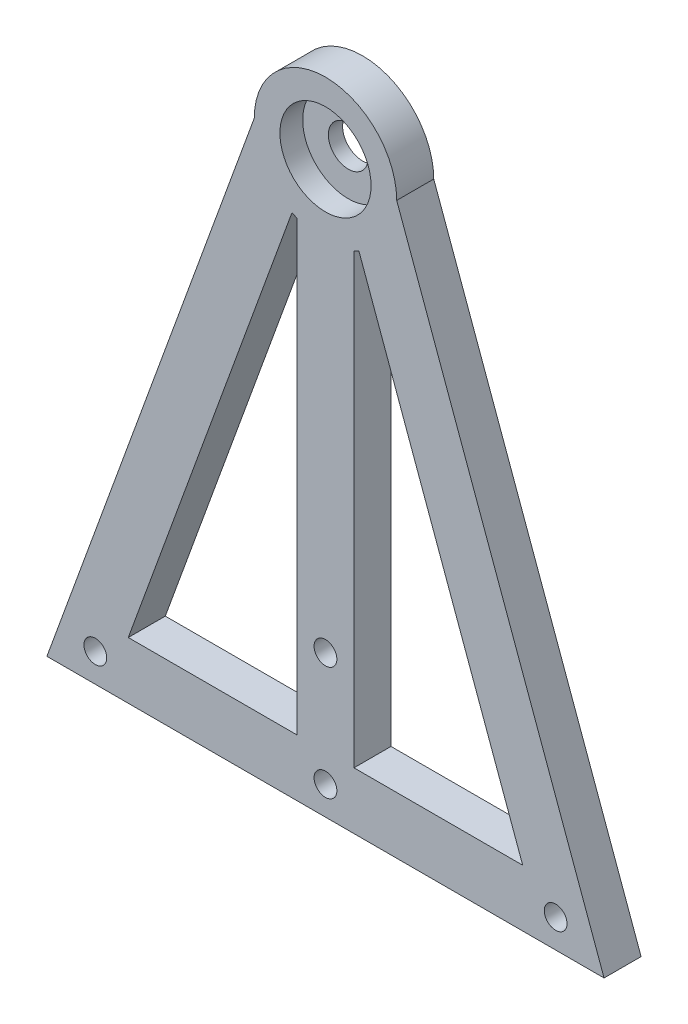
ISO-10303-21;
HEADER;
FILE_DESCRIPTION(('STEP AP214'),'2;1');
FILE_NAME('part.step','',(''),(''),'','','');
FILE_SCHEMA(('AUTOMOTIVE_DESIGN { 1 0 10303 214 1 1 1 1 }'));
ENDSEC;
DATA;
#1=APPLICATION_CONTEXT('core data for automotive mechanical design processes');
#2=APPLICATION_PROTOCOL_DEFINITION('international standard','automotive_design',2000,#1);
#3=PRODUCT_CONTEXT('',#1,'mechanical');
#4=PRODUCT('Part','Part','',(#3));
#5=PRODUCT_RELATED_PRODUCT_CATEGORY('part','',(#4));
#6=PRODUCT_DEFINITION_FORMATION('','',#4);
#7=PRODUCT_DEFINITION_CONTEXT('part definition',#1,'design');
#8=PRODUCT_DEFINITION('design','',#6,#7);
#9=PRODUCT_DEFINITION_SHAPE('','',#8);
#10=(LENGTH_UNIT() NAMED_UNIT(*) SI_UNIT(.MILLI.,.METRE.));
#11=(NAMED_UNIT(*) PLANE_ANGLE_UNIT() SI_UNIT($,.RADIAN.));
#12=(NAMED_UNIT(*) SI_UNIT($,.STERADIAN.) SOLID_ANGLE_UNIT());
#13=UNCERTAINTY_MEASURE_WITH_UNIT(LENGTH_MEASURE(1.E-05),#10,'distance_accuracy_value','');
#14=(GEOMETRIC_REPRESENTATION_CONTEXT(3) GLOBAL_UNCERTAINTY_ASSIGNED_CONTEXT((#13)) GLOBAL_UNIT_ASSIGNED_CONTEXT((#10,
#11,#12)) REPRESENTATION_CONTEXT('',''));
#15=CARTESIAN_POINT('',(0.,0.,0.));
#16=DIRECTION('',(0.,0.,1.));
#17=DIRECTION('',(1.,0.,0.));
#18=AXIS2_PLACEMENT_3D('',#15,#16,#17);
#19=CARTESIAN_POINT('',(0.,100.,-0.00100000000000013));
#20=DIRECTION('',(0.,0.,1.));
#21=DIRECTION('',(1.,0.,0.));
#22=AXIS2_PLACEMENT_3D('',#19,#20,#21);
#23=CYLINDRICAL_SURFACE('',#22,3.5);
#24=CARTESIAN_POINT('',(0.,100.,0.));
#25=DIRECTION('',(0.,0.,1.));
#26=DIRECTION('',(1.,0.,0.));
#27=AXIS2_PLACEMENT_3D('',#24,#25,#26);
#28=CIRCLE('',#27,3.5);
#29=CARTESIAN_POINT('',(3.5,100.,0.));
#30=VERTEX_POINT('',#29);
#31=EDGE_CURVE('E257',#30,#30,#28,.F.);
#32=CARTESIAN_POINT('',(0.,100.,2.5));
#33=DIRECTION('',(0.,0.,1.));
#34=DIRECTION('',(1.,0.,0.));
#35=AXIS2_PLACEMENT_3D('',#32,#33,#34);
#36=CIRCLE('',#35,3.5);
#37=CARTESIAN_POINT('',(3.5,100.,2.5));
#38=VERTEX_POINT('',#37);
#39=EDGE_CURVE('E444',#38,#38,#36,.T.);
#40=CARTESIAN_POINT('',(3.5,100.,0.));
#41=CARTESIAN_POINT('',(3.5,100.,0.0260416666666666));
#42=CARTESIAN_POINT('',(3.5,100.,0.0520833333333333));
#43=CARTESIAN_POINT('',(3.5,100.,0.104166666666667));
#44=CARTESIAN_POINT('',(3.5,100.,0.130208333333333));
#45=CARTESIAN_POINT('',(3.5,100.,0.182291666666667));
#46=CARTESIAN_POINT('',(3.5,100.,0.208333333333333));
#47=CARTESIAN_POINT('',(3.5,100.,0.260416666666667));
#48=CARTESIAN_POINT('',(3.5,100.,0.286458333333333));
#49=CARTESIAN_POINT('',(3.5,100.,0.338541666666667));
#50=CARTESIAN_POINT('',(3.5,100.,0.364583333333333));
#51=CARTESIAN_POINT('',(3.5,100.,0.416666666666667));
#52=CARTESIAN_POINT('',(3.5,100.,0.442708333333333));
#53=CARTESIAN_POINT('',(3.5,100.,0.494791666666667));
#54=CARTESIAN_POINT('',(3.5,100.,0.520833333333333));
#55=CARTESIAN_POINT('',(3.5,100.,0.572916666666666));
#56=CARTESIAN_POINT('',(3.5,100.,0.598958333333333));
#57=CARTESIAN_POINT('',(3.5,100.,0.651041666666666));
#58=CARTESIAN_POINT('',(3.5,100.,0.677083333333333));
#59=CARTESIAN_POINT('',(3.5,100.,0.729166666666666));
#60=CARTESIAN_POINT('',(3.5,100.,0.755208333333333));
#61=CARTESIAN_POINT('',(3.5,100.,0.807291666666666));
#62=CARTESIAN_POINT('',(3.5,100.,0.833333333333333));
#63=CARTESIAN_POINT('',(3.5,100.,0.885416666666666));
#64=CARTESIAN_POINT('',(3.5,100.,0.911458333333333));
#65=CARTESIAN_POINT('',(3.5,100.,0.963541666666666));
#66=CARTESIAN_POINT('',(3.5,100.,0.989583333333333));
#67=CARTESIAN_POINT('',(3.5,100.,1.04166666666667));
#68=CARTESIAN_POINT('',(3.5,100.,1.06770833333333));
#69=CARTESIAN_POINT('',(3.5,100.,1.11979166666667));
#70=CARTESIAN_POINT('',(3.5,100.,1.14583333333333));
#71=CARTESIAN_POINT('',(3.5,100.,1.19791666666667));
#72=CARTESIAN_POINT('',(3.5,100.,1.22395833333333));
#73=CARTESIAN_POINT('',(3.5,100.,1.27604166666667));
#74=CARTESIAN_POINT('',(3.5,100.,1.30208333333333));
#75=CARTESIAN_POINT('',(3.5,100.,1.35416666666667));
#76=CARTESIAN_POINT('',(3.5,100.,1.38020833333333));
#77=CARTESIAN_POINT('',(3.5,100.,1.43229166666667));
#78=CARTESIAN_POINT('',(3.5,100.,1.45833333333333));
#79=CARTESIAN_POINT('',(3.5,100.,1.51041666666667));
#80=CARTESIAN_POINT('',(3.5,100.,1.53645833333333));
#81=CARTESIAN_POINT('',(3.5,100.,1.58854166666667));
#82=CARTESIAN_POINT('',(3.5,100.,1.61458333333333));
#83=CARTESIAN_POINT('',(3.5,100.,1.66666666666667));
#84=CARTESIAN_POINT('',(3.5,100.,1.69270833333333));
#85=CARTESIAN_POINT('',(3.5,100.,1.74479166666667));
#86=CARTESIAN_POINT('',(3.5,100.,1.77083333333333));
#87=CARTESIAN_POINT('',(3.5,100.,1.82291666666667));
#88=CARTESIAN_POINT('',(3.5,100.,1.84895833333333));
#89=CARTESIAN_POINT('',(3.5,100.,1.90104166666667));
#90=CARTESIAN_POINT('',(3.5,100.,1.92708333333333));
#91=CARTESIAN_POINT('',(3.5,100.,1.97916666666667));
#92=CARTESIAN_POINT('',(3.5,100.,2.00520833333333));
#93=CARTESIAN_POINT('',(3.5,100.,2.05729166666667));
#94=CARTESIAN_POINT('',(3.5,100.,2.08333333333333));
#95=CARTESIAN_POINT('',(3.5,100.,2.13541666666667));
#96=CARTESIAN_POINT('',(3.5,100.,2.16145833333333));
#97=CARTESIAN_POINT('',(3.5,100.,2.21354166666667));
#98=CARTESIAN_POINT('',(3.5,100.,2.23958333333333));
#99=CARTESIAN_POINT('',(3.5,100.,2.29166666666667));
#100=CARTESIAN_POINT('',(3.5,100.,2.31770833333333));
#101=CARTESIAN_POINT('',(3.5,100.,2.36979166666667));
#102=CARTESIAN_POINT('',(3.5,100.,2.39583333333333));
#103=CARTESIAN_POINT('',(3.5,100.,2.44791666666667));
#104=CARTESIAN_POINT('',(3.5,100.,2.47395833333333));
#105=CARTESIAN_POINT('',(3.5,100.,2.5));
#106=B_SPLINE_CURVE_WITH_KNOTS('',3,(#40,#41,#42,#43,#44,#45,#46,#47,#48,#49,#50,#51,#52,#53,
#54,#55,#56,#57,#58,#59,#60,#61,#62,#63,#64,#65,#66,#67,#68,#69,#70,#71,#72,#73,#74,#75,#76,#77,
#78,#79,#80,#81,#82,#83,#84,#85,#86,#87,#88,#89,#90,#91,#92,#93,#94,#95,#96,#97,#98,#99,#100,
#101,#102,#103,#104,#105),.UNSPECIFIED.,.F.,.F.,(4,2,2,2,2,2,2,2,2,2,2,2,2,2,2,2,2,2,2,2,2,2,2,
2,2,2,2,2,2,2,2,2,4),(0.,0.078125,0.15625,0.234375,0.3125,0.390625,0.46875,0.546875,0.625,
0.703125,0.78125,0.859375,0.9375,1.015625,1.09375,1.171875,1.25,1.328125,1.40625,1.484375,
1.5625,1.640625,1.71875,1.796875,1.875,1.953125,2.03125,2.109375,2.1875,2.265625,2.34375,
2.421875,2.5),.UNSPECIFIED.);
#107=EDGE_CURVE('BSEAM123',#30,#38,#106,.T.);
#108=ORIENTED_EDGE('',*,*,#31,.T.);
#109=ORIENTED_EDGE('',*,*,#39,.T.);
#110=ORIENTED_EDGE('',*,*,#107,.T.);
#111=ORIENTED_EDGE('',*,*,#107,.F.);
#112=EDGE_LOOP('',(#108,#110,#109,#111));
#113=FACE_BOUND('',#112,.T.);
#114=ADVANCED_FACE('F123',(#113),#23,.F.);
#115=CARTESIAN_POINT('',(0.,100.,6.5));
#116=DIRECTION('',(0.,0.,-1.));
#117=DIRECTION('',(-1.,0.,0.));
#118=AXIS2_PLACEMENT_3D('',#115,#116,#117);
#119=CYLINDRICAL_SURFACE('',#118,12.5);
#120=CARTESIAN_POINT('',(0.,100.,6.5));
#121=DIRECTION('',(0.,0.,1.));
#122=DIRECTION('',(1.,0.,0.));
#123=AXIS2_PLACEMENT_3D('',#120,#121,#122);
#124=CIRCLE('',#123,12.5);
#125=CARTESIAN_POINT('',(-5.87418415032342,88.9662354308201,6.5));
#126=VERTEX_POINT('',#125);
#127=CARTESIAN_POINT('',(-5.,88.5435607626104,6.5));
#128=VERTEX_POINT('',#127);
#129=EDGE_CURVE('E227',#126,#128,#124,.T.);
#130=ORIENTED_EDGE('',*,*,#129,.F.);
#131=DIRECTION('',(0.,0.,-1.));
#132=VECTOR('',#131,1.);
#133=CARTESIAN_POINT('',(-5.87418415032343,88.9662354308201,6.5));
#134=LINE('',#133,#132);
#135=CARTESIAN_POINT('',(-5.87418415032342,88.9662354308201,0.));
#136=VERTEX_POINT('',#135);
#137=EDGE_CURVE('E262',#126,#136,#134,.T.);
#138=ORIENTED_EDGE('',*,*,#137,.T.);
#139=CARTESIAN_POINT('',(0.,100.,0.));
#140=DIRECTION('',(0.,0.,1.));
#141=DIRECTION('',(1.,0.,0.));
#142=AXIS2_PLACEMENT_3D('',#139,#140,#141);
#143=CIRCLE('',#142,12.5);
#144=CARTESIAN_POINT('',(-5.,88.5435607626104,0.));
#145=VERTEX_POINT('',#144);
#146=EDGE_CURVE('E229',#136,#145,#143,.T.);
#147=ORIENTED_EDGE('',*,*,#146,.T.);
#148=DIRECTION('',(0.,0.,-1.));
#149=VECTOR('',#148,1.);
#150=CARTESIAN_POINT('',(-5.,88.5435607626104,6.5));
#151=LINE('',#150,#149);
#152=EDGE_CURVE('E224',#145,#128,#151,.F.);
#153=ORIENTED_EDGE('',*,*,#152,.T.);
#154=EDGE_LOOP('',(#130,#138,#147,#153));
#155=FACE_BOUND('',#154,.T.);
#156=ADVANCED_FACE('F225',(#155),#119,.T.);
#157=DIRECTION('',(0.,0.,-1.));
#158=VECTOR('',#157,1.);
#159=CARTESIAN_POINT('',(5.87418415032342,88.9662354308201,6.5));
#160=LINE('',#159,#158);
#161=CARTESIAN_POINT('',(5.87418415032342,88.9662354308201,6.5));
#162=VERTEX_POINT('',#161);
#163=CARTESIAN_POINT('',(5.87418415032342,88.9662354308201,0.));
#164=VERTEX_POINT('',#163);
#165=EDGE_CURVE('E143',#162,#164,#160,.T.);
#166=ORIENTED_EDGE('',*,*,#165,.F.);
#167=CARTESIAN_POINT('',(4.99999999999998,88.5435607626104,6.5));
#168=VERTEX_POINT('',#167);
#169=EDGE_CURVE('E248',#168,#162,#124,.T.);
#170=ORIENTED_EDGE('',*,*,#169,.F.);
#171=DIRECTION('',(0.,0.,-1.));
#172=VECTOR('',#171,1.);
#173=CARTESIAN_POINT('',(4.99999999999998,88.5435607626104,6.5));
#174=LINE('',#173,#172);
#175=CARTESIAN_POINT('',(4.99999999999997,88.5435607626104,0.));
#176=VERTEX_POINT('',#175);
#177=EDGE_CURVE('E127',#168,#176,#174,.T.);
#178=ORIENTED_EDGE('',*,*,#177,.T.);
#179=EDGE_CURVE('E260',#176,#164,#143,.T.);
#180=ORIENTED_EDGE('',*,*,#179,.T.);
#181=EDGE_LOOP('',(#166,#170,#178,#180));
#182=FACE_BOUND('',#181,.T.);
#183=ADVANCED_FACE('F364',(#182),#119,.T.);
#184=DIRECTION('',(0.,0.,-1.));
#185=VECTOR('',#184,1.);
#186=CARTESIAN_POINT('',(-12.5,100.,6.5));
#187=LINE('',#186,#185);
#188=CARTESIAN_POINT('',(-12.5,100.,6.5));
#189=VERTEX_POINT('',#188);
#190=CARTESIAN_POINT('',(-12.5,100.,0.));
#191=VERTEX_POINT('',#190);
#192=EDGE_CURVE('E12',#189,#191,#187,.T.);
#193=ORIENTED_EDGE('',*,*,#192,.F.);
#194=CARTESIAN_POINT('',(12.5,100.,6.5));
#195=VERTEX_POINT('',#194);
#196=EDGE_CURVE('E232',#195,#189,#124,.T.);
#197=ORIENTED_EDGE('',*,*,#196,.F.);
#198=DIRECTION('',(0.,0.,-1.));
#199=VECTOR('',#198,1.);
#200=CARTESIAN_POINT('',(12.5,100.,6.5));
#201=LINE('',#200,#199);
#202=CARTESIAN_POINT('',(12.5,100.,0.));
#203=VERTEX_POINT('',#202);
#204=EDGE_CURVE('E134',#195,#203,#201,.T.);
#205=ORIENTED_EDGE('',*,*,#204,.T.);
#206=EDGE_CURVE('E254',#203,#191,#143,.T.);
#207=ORIENTED_EDGE('',*,*,#206,.T.);
#208=EDGE_LOOP('',(#193,#197,#205,#207));
#209=FACE_BOUND('',#208,.T.);
#210=ADVANCED_FACE('F366',(#209),#119,.T.);
#211=CARTESIAN_POINT('',(0.,100.,0.));
#212=DIRECTION('',(0.,0.,1.));
#213=DIRECTION('',(1.,0.,0.));
#214=AXIS2_PLACEMENT_3D('',#211,#212,#213);
#215=PLANE('',#214);
#216=CARTESIAN_POINT('',(-40.3970234266207,5.,0.));
#217=DIRECTION('',(0.,0.,1.));
#218=DIRECTION('',(1.,0.,0.));
#219=AXIS2_PLACEMENT_3D('',#216,#217,#218);
#220=CIRCLE('',#219,2.);
#221=CARTESIAN_POINT('',(-38.3970234266207,5.,0.));
#222=VERTEX_POINT('',#221);
#223=EDGE_CURVE('E426',#222,#222,#220,.F.);
#224=ORIENTED_EDGE('',*,*,#223,.F.);
#225=EDGE_LOOP('',(#224));
#226=FACE_BOUND('',#225,.T.);
#227=CARTESIAN_POINT('',(0.,5.,0.));
#228=DIRECTION('',(0.,0.,1.));
#229=DIRECTION('',(1.,0.,0.));
#230=AXIS2_PLACEMENT_3D('',#227,#228,#229);
#231=CIRCLE('',#230,2.);
#232=CARTESIAN_POINT('',(2.,5.,0.));
#233=VERTEX_POINT('',#232);
#234=EDGE_CURVE('E430',#233,#233,#231,.F.);
#235=ORIENTED_EDGE('',*,*,#234,.F.);
#236=EDGE_LOOP('',(#235));
#237=FACE_BOUND('',#236,.T.);
#238=CARTESIAN_POINT('',(40.3970234266207,5.00000000000002,0.));
#239=DIRECTION('',(0.,0.,1.));
#240=DIRECTION('',(1.,0.,0.));
#241=AXIS2_PLACEMENT_3D('',#238,#239,#240);
#242=CIRCLE('',#241,2.);
#243=CARTESIAN_POINT('',(42.3970234266207,5.00000000000002,0.));
#244=VERTEX_POINT('',#243);
#245=EDGE_CURVE('E434',#244,#244,#242,.F.);
#246=ORIENTED_EDGE('',*,*,#245,.F.);
#247=EDGE_LOOP('',(#246));
#248=FACE_BOUND('',#247,.T.);
#249=CARTESIAN_POINT('',(0.,25.,0.));
#250=DIRECTION('',(0.,0.,1.));
#251=DIRECTION('',(1.,0.,0.));
#252=AXIS2_PLACEMENT_3D('',#249,#250,#251);
#253=CIRCLE('',#252,2.);
#254=CARTESIAN_POINT('',(2.,25.,0.));
#255=VERTEX_POINT('',#254);
#256=EDGE_CURVE('E438',#255,#255,#253,.F.);
#257=ORIENTED_EDGE('',*,*,#256,.F.);
#258=EDGE_LOOP('',(#257));
#259=FACE_BOUND('',#258,.T.);
#260=ORIENTED_EDGE('',*,*,#31,.F.);
#261=EDGE_LOOP('',(#260));
#262=FACE_BOUND('',#261,.T.);
#263=DIRECTION('',(0.,1.,0.));
#264=VECTOR('',#263,1.);
#265=CARTESIAN_POINT('',(5.,10.,0.));
#266=LINE('',#265,#264);
#267=CARTESIAN_POINT('',(4.99999999999998,10.,0.));
#268=VERTEX_POINT('',#267);
#269=EDGE_CURVE('E334',#268,#176,#266,.T.);
#270=ORIENTED_EDGE('',*,*,#269,.F.);
#271=DIRECTION('',(1.,0.,0.));
#272=VECTOR('',#271,1.);
#273=CARTESIAN_POINT('',(-34.6155433591995,10.,0.));
#274=LINE('',#273,#272);
#275=CARTESIAN_POINT('',(34.6155433591995,9.99999999999999,0.));
#276=VERTEX_POINT('',#275);
#277=EDGE_CURVE('E292',#268,#276,#274,.T.);
#278=ORIENTED_EDGE('',*,*,#277,.T.);
#279=DIRECTION('',(0.342020143325673,-0.939692620785907,0.));
#280=VECTOR('',#279,1.);
#281=CARTESIAN_POINT('',(5.87418415032343,88.9662354308201,0.));
#282=LINE('',#281,#280);
#283=EDGE_CURVE('E297',#164,#276,#282,.T.);
#284=ORIENTED_EDGE('',*,*,#283,.F.);
#285=ORIENTED_EDGE('',*,*,#179,.F.);
#286=EDGE_LOOP('',(#270,#278,#284,#285));
#287=FACE_BOUND('',#286,.T.);
#288=ORIENTED_EDGE('',*,*,#206,.F.);
#289=DIRECTION('',(0.342020143325673,-0.939692620785907,0.));
#290=VECTOR('',#289,1.);
#291=CARTESIAN_POINT('',(12.5,100.,0.));
#292=LINE('',#291,#290);
#293=CARTESIAN_POINT('',(48.8970234266207,0.,0.));
#294=VERTEX_POINT('',#293);
#295=EDGE_CURVE('E301',#203,#294,#292,.T.);
#296=ORIENTED_EDGE('',*,*,#295,.T.);
#297=DIRECTION('',(1.,0.,0.));
#298=VECTOR('',#297,1.);
#299=CARTESIAN_POINT('',(-48.8970234266207,0.,0.));
#300=LINE('',#299,#298);
#301=CARTESIAN_POINT('',(-48.8970234266207,0.,0.));
#302=VERTEX_POINT('',#301);
#303=EDGE_CURVE('E305',#302,#294,#300,.T.);
#304=ORIENTED_EDGE('',*,*,#303,.F.);
#305=DIRECTION('',(-0.342020143325673,-0.939692620785907,0.));
#306=VECTOR('',#305,1.);
#307=CARTESIAN_POINT('',(-12.5,100.,0.));
#308=LINE('',#307,#306);
#309=EDGE_CURVE('E270',#191,#302,#308,.T.);
#310=ORIENTED_EDGE('',*,*,#309,.F.);
#311=EDGE_LOOP('',(#288,#296,#304,#310));
#312=FACE_BOUND('',#311,.T.);
#313=CARTESIAN_POINT('',(-34.6155433591995,10.,0.));
#314=VERTEX_POINT('',#313);
#315=CARTESIAN_POINT('',(-5.,10.,0.));
#316=VERTEX_POINT('',#315);
#317=EDGE_CURVE('E293',#314,#316,#274,.T.);
#318=ORIENTED_EDGE('',*,*,#317,.T.);
#319=DIRECTION('',(0.,1.,0.));
#320=VECTOR('',#319,1.);
#321=CARTESIAN_POINT('',(-5.,10.,0.));
#322=LINE('',#321,#320);
#323=EDGE_CURVE('E332',#316,#145,#322,.T.);
#324=ORIENTED_EDGE('',*,*,#323,.T.);
#325=ORIENTED_EDGE('',*,*,#146,.F.);
#326=DIRECTION('',(-0.342020143325673,-0.939692620785907,0.));
#327=VECTOR('',#326,1.);
#328=CARTESIAN_POINT('',(-5.87418415032343,88.9662354308201,0.));
#329=LINE('',#328,#327);
#330=EDGE_CURVE('E240',#136,#314,#329,.T.);
#331=ORIENTED_EDGE('',*,*,#330,.T.);
#332=EDGE_LOOP('',(#318,#324,#325,#331));
#333=FACE_BOUND('',#332,.T.);
#334=ADVANCED_FACE('F339',(#226,#237,#248,#259,#262,#287,#312,#333),#215,.F.);
#335=CARTESIAN_POINT('',(0.,100.,6.5));
#336=DIRECTION('',(0.,0.,1.));
#337=DIRECTION('',(1.,0.,0.));
#338=AXIS2_PLACEMENT_3D('',#335,#336,#337);
#339=PLANE('',#338);
#340=CARTESIAN_POINT('',(-40.3970234266207,5.,6.5));
#341=DIRECTION('',(0.,0.,1.));
#342=DIRECTION('',(1.,0.,0.));
#343=AXIS2_PLACEMENT_3D('',#340,#341,#342);
#344=CIRCLE('',#343,2.);
#345=CARTESIAN_POINT('',(-38.3970234266207,5.,6.5));
#346=VERTEX_POINT('',#345);
#347=EDGE_CURVE('E458',#346,#346,#344,.T.);
#348=ORIENTED_EDGE('',*,*,#347,.F.);
#349=EDGE_LOOP('',(#348));
#350=FACE_BOUND('',#349,.T.);
#351=CARTESIAN_POINT('',(0.,5.,6.5));
#352=DIRECTION('',(0.,0.,1.));
#353=DIRECTION('',(1.,0.,0.));
#354=AXIS2_PLACEMENT_3D('',#351,#352,#353);
#355=CIRCLE('',#354,2.);
#356=CARTESIAN_POINT('',(2.,5.,6.5));
#357=VERTEX_POINT('',#356);
#358=EDGE_CURVE('E463',#357,#357,#355,.T.);
#359=ORIENTED_EDGE('',*,*,#358,.F.);
#360=EDGE_LOOP('',(#359));
#361=FACE_BOUND('',#360,.T.);
#362=CARTESIAN_POINT('',(40.3970234266207,5.00000000000002,6.5));
#363=DIRECTION('',(0.,0.,1.));
#364=DIRECTION('',(1.,0.,0.));
#365=AXIS2_PLACEMENT_3D('',#362,#363,#364);
#366=CIRCLE('',#365,2.);
#367=CARTESIAN_POINT('',(42.3970234266207,5.00000000000002,6.5));
#368=VERTEX_POINT('',#367);
#369=EDGE_CURVE('E468',#368,#368,#366,.T.);
#370=ORIENTED_EDGE('',*,*,#369,.F.);
#371=EDGE_LOOP('',(#370));
#372=FACE_BOUND('',#371,.T.);
#373=CARTESIAN_POINT('',(0.,25.,6.5));
#374=DIRECTION('',(0.,0.,1.));
#375=DIRECTION('',(1.,0.,0.));
#376=AXIS2_PLACEMENT_3D('',#373,#374,#375);
#377=CIRCLE('',#376,2.);
#378=CARTESIAN_POINT('',(2.,25.,6.5));
#379=VERTEX_POINT('',#378);
#380=EDGE_CURVE('E474',#379,#379,#377,.T.);
#381=ORIENTED_EDGE('',*,*,#380,.F.);
#382=EDGE_LOOP('',(#381));
#383=FACE_BOUND('',#382,.T.);
#384=CARTESIAN_POINT('',(0.,100.,6.5));
#385=DIRECTION('',(0.,0.,1.));
#386=DIRECTION('',(1.,0.,0.));
#387=AXIS2_PLACEMENT_3D('',#384,#385,#386);
#388=CIRCLE('',#387,8.);
#389=CARTESIAN_POINT('',(8.,100.,6.5));
#390=VERTEX_POINT('',#389);
#391=EDGE_CURVE('E450',#390,#390,#388,.T.);
#392=ORIENTED_EDGE('',*,*,#391,.F.);
#393=EDGE_LOOP('',(#392));
#394=FACE_BOUND('',#393,.T.);
#395=DIRECTION('',(1.,0.,0.));
#396=VECTOR('',#395,1.);
#397=CARTESIAN_POINT('',(-34.6155433591995,10.,6.5));
#398=LINE('',#397,#396);
#399=CARTESIAN_POINT('',(4.99999999999998,10.,6.5));
#400=VERTEX_POINT('',#399);
#401=CARTESIAN_POINT('',(34.6155433591995,9.99999999999999,6.5));
#402=VERTEX_POINT('',#401);
#403=EDGE_CURVE('E269',#400,#402,#398,.T.);
#404=ORIENTED_EDGE('',*,*,#403,.F.);
#405=DIRECTION('',(0.,1.,0.));
#406=VECTOR('',#405,1.);
#407=CARTESIAN_POINT('',(5.,10.,6.5));
#408=LINE('',#407,#406);
#409=EDGE_CURVE('E241',#400,#168,#408,.T.);
#410=ORIENTED_EDGE('',*,*,#409,.T.);
#411=ORIENTED_EDGE('',*,*,#169,.T.);
#412=DIRECTION('',(0.342020143325673,-0.939692620785907,0.));
#413=VECTOR('',#412,1.);
#414=CARTESIAN_POINT('',(5.87418415032343,88.9662354308201,6.5));
#415=LINE('',#414,#413);
#416=EDGE_CURVE('E274',#162,#402,#415,.T.);
#417=ORIENTED_EDGE('',*,*,#416,.T.);
#418=EDGE_LOOP('',(#404,#410,#411,#417));
#419=FACE_BOUND('',#418,.T.);
#420=DIRECTION('',(0.342020143325673,-0.939692620785907,0.));
#421=VECTOR('',#420,1.);
#422=CARTESIAN_POINT('',(12.5,100.,6.5));
#423=LINE('',#422,#421);
#424=CARTESIAN_POINT('',(48.8970234266207,0.,6.5));
#425=VERTEX_POINT('',#424);
#426=EDGE_CURVE('E278',#195,#425,#423,.T.);
#427=ORIENTED_EDGE('',*,*,#426,.F.);
#428=ORIENTED_EDGE('',*,*,#196,.T.);
#429=DIRECTION('',(-0.342020143325673,-0.939692620785907,0.));
#430=VECTOR('',#429,1.);
#431=CARTESIAN_POINT('',(-12.5,100.,6.5));
#432=LINE('',#431,#430);
#433=CARTESIAN_POINT('',(-48.8970234266207,0.,6.5));
#434=VERTEX_POINT('',#433);
#435=EDGE_CURVE('E285',#189,#434,#432,.T.);
#436=ORIENTED_EDGE('',*,*,#435,.T.);
#437=DIRECTION('',(1.,0.,0.));
#438=VECTOR('',#437,1.);
#439=CARTESIAN_POINT('',(-48.8970234266207,0.,6.5));
#440=LINE('',#439,#438);
#441=EDGE_CURVE('E282',#434,#425,#440,.T.);
#442=ORIENTED_EDGE('',*,*,#441,.T.);
#443=EDGE_LOOP('',(#427,#428,#436,#442));
#444=FACE_BOUND('',#443,.T.);
#445=DIRECTION('',(0.,1.,0.));
#446=VECTOR('',#445,1.);
#447=CARTESIAN_POINT('',(-5.,10.,6.5));
#448=LINE('',#447,#446);
#449=CARTESIAN_POINT('',(-5.,10.,6.5));
#450=VERTEX_POINT('',#449);
#451=EDGE_CURVE('E234',#450,#128,#448,.T.);
#452=ORIENTED_EDGE('',*,*,#451,.F.);
#453=CARTESIAN_POINT('',(-34.6155433591995,10.,6.5));
#454=VERTEX_POINT('',#453);
#455=EDGE_CURVE('E271',#454,#450,#398,.T.);
#456=ORIENTED_EDGE('',*,*,#455,.F.);
#457=DIRECTION('',(-0.342020143325673,-0.939692620785907,0.));
#458=VECTOR('',#457,1.);
#459=CARTESIAN_POINT('',(-5.87418415032343,88.9662354308201,6.5));
#460=LINE('',#459,#458);
#461=EDGE_CURVE('E246',#126,#454,#460,.T.);
#462=ORIENTED_EDGE('',*,*,#461,.F.);
#463=ORIENTED_EDGE('',*,*,#129,.T.);
#464=EDGE_LOOP('',(#452,#456,#462,#463));
#465=FACE_BOUND('',#464,.T.);
#466=ADVANCED_FACE('F244',(#350,#361,#372,#383,#394,#419,#444,#465),#339,.T.);
#467=CARTESIAN_POINT('',(-12.5,100.,6.5));
#468=DIRECTION('',(0.939692620785907,-0.342020143325673,0.));
#469=DIRECTION('',(0.342020143325673,0.939692620785907,0.));
#470=AXIS2_PLACEMENT_3D('',#467,#468,#469);
#471=PLANE('',#470);
#472=ORIENTED_EDGE('',*,*,#309,.T.);
#473=DIRECTION('',(0.,0.,-1.));
#474=VECTOR('',#473,1.);
#475=CARTESIAN_POINT('',(-48.8970234266207,0.,6.5));
#476=LINE('',#475,#474);
#477=EDGE_CURVE('E311',#434,#302,#476,.T.);
#478=ORIENTED_EDGE('',*,*,#477,.F.);
#479=ORIENTED_EDGE('',*,*,#435,.F.);
#480=ORIENTED_EDGE('',*,*,#192,.T.);
#481=EDGE_LOOP('',(#472,#478,#479,#480));
#482=FACE_BOUND('',#481,.T.);
#483=ADVANCED_FACE('F358',(#482),#471,.F.);
#484=CARTESIAN_POINT('',(-48.8970234266207,0.,6.5));
#485=DIRECTION('',(0.,1.,0.));
#486=DIRECTION('',(-1.,0.,0.));
#487=AXIS2_PLACEMENT_3D('',#484,#485,#486);
#488=PLANE('',#487);
#489=ORIENTED_EDGE('',*,*,#303,.T.);
#490=DIRECTION('',(0.,0.,-1.));
#491=VECTOR('',#490,1.);
#492=CARTESIAN_POINT('',(48.8970234266207,0.,6.5));
#493=LINE('',#492,#491);
#494=EDGE_CURVE('E315',#425,#294,#493,.T.);
#495=ORIENTED_EDGE('',*,*,#494,.F.);
#496=ORIENTED_EDGE('',*,*,#441,.F.);
#497=ORIENTED_EDGE('',*,*,#477,.T.);
#498=EDGE_LOOP('',(#489,#495,#496,#497));
#499=FACE_BOUND('',#498,.T.);
#500=ADVANCED_FACE('F372',(#499),#488,.F.);
#501=CARTESIAN_POINT('',(12.5,100.,6.5));
#502=DIRECTION('',(0.939692620785907,0.342020143325673,0.));
#503=DIRECTION('',(-0.342020143325673,0.939692620785907,0.));
#504=AXIS2_PLACEMENT_3D('',#501,#502,#503);
#505=PLANE('',#504);
#506=ORIENTED_EDGE('',*,*,#295,.F.);
#507=ORIENTED_EDGE('',*,*,#204,.F.);
#508=ORIENTED_EDGE('',*,*,#426,.T.);
#509=ORIENTED_EDGE('',*,*,#494,.T.);
#510=EDGE_LOOP('',(#506,#507,#508,#509));
#511=FACE_BOUND('',#510,.T.);
#512=ADVANCED_FACE('F379',(#511),#505,.T.);
#513=CARTESIAN_POINT('',(5.87418415032343,88.9662354308201,6.5));
#514=DIRECTION('',(0.939692620785907,0.342020143325673,0.));
#515=DIRECTION('',(-0.342020143325673,0.939692620785907,0.));
#516=AXIS2_PLACEMENT_3D('',#513,#514,#515);
#517=PLANE('',#516);
#518=ORIENTED_EDGE('',*,*,#283,.T.);
#519=DIRECTION('',(0.,0.,-1.));
#520=VECTOR('',#519,1.);
#521=CARTESIAN_POINT('',(34.6155433591995,9.99999999999999,6.5));
#522=LINE('',#521,#520);
#523=EDGE_CURVE('E318',#402,#276,#522,.T.);
#524=ORIENTED_EDGE('',*,*,#523,.F.);
#525=ORIENTED_EDGE('',*,*,#416,.F.);
#526=ORIENTED_EDGE('',*,*,#165,.T.);
#527=EDGE_LOOP('',(#518,#524,#525,#526));
#528=FACE_BOUND('',#527,.T.);
#529=ADVANCED_FACE('F389',(#528),#517,.F.);
#530=CARTESIAN_POINT('',(-34.6155433591995,10.,6.5));
#531=DIRECTION('',(0.,1.,0.));
#532=DIRECTION('',(-1.,0.,0.));
#533=AXIS2_PLACEMENT_3D('',#530,#531,#532);
#534=PLANE('',#533);
#535=ORIENTED_EDGE('',*,*,#277,.F.);
#536=DIRECTION('',(0.,0.,1.));
#537=VECTOR('',#536,1.);
#538=CARTESIAN_POINT('',(5.,10.,6.5));
#539=LINE('',#538,#537);
#540=EDGE_CURVE('E190',#268,#400,#539,.T.);
#541=ORIENTED_EDGE('',*,*,#540,.T.);
#542=ORIENTED_EDGE('',*,*,#403,.T.);
#543=ORIENTED_EDGE('',*,*,#523,.T.);
#544=EDGE_LOOP('',(#535,#541,#542,#543));
#545=FACE_BOUND('',#544,.T.);
#546=ADVANCED_FACE('F353',(#545),#534,.T.);
#547=DIRECTION('',(0.,0.,1.));
#548=VECTOR('',#547,1.);
#549=CARTESIAN_POINT('',(-5.,10.,6.5));
#550=LINE('',#549,#548);
#551=EDGE_CURVE('E184',#316,#450,#550,.T.);
#552=ORIENTED_EDGE('',*,*,#551,.F.);
#553=ORIENTED_EDGE('',*,*,#317,.F.);
#554=DIRECTION('',(0.,0.,-1.));
#555=VECTOR('',#554,1.);
#556=CARTESIAN_POINT('',(-34.6155433591995,10.,6.5));
#557=LINE('',#556,#555);
#558=EDGE_CURVE('E288',#454,#314,#557,.T.);
#559=ORIENTED_EDGE('',*,*,#558,.F.);
#560=ORIENTED_EDGE('',*,*,#455,.T.);
#561=EDGE_LOOP('',(#552,#553,#559,#560));
#562=FACE_BOUND('',#561,.T.);
#563=ADVANCED_FACE('F343',(#562),#534,.T.);
#564=CARTESIAN_POINT('',(-5.87418415032343,88.9662354308201,6.5));
#565=DIRECTION('',(0.939692620785907,-0.342020143325673,0.));
#566=DIRECTION('',(0.342020143325673,0.939692620785907,0.));
#567=AXIS2_PLACEMENT_3D('',#564,#565,#566);
#568=PLANE('',#567);
#569=ORIENTED_EDGE('',*,*,#330,.F.);
#570=ORIENTED_EDGE('',*,*,#137,.F.);
#571=ORIENTED_EDGE('',*,*,#461,.T.);
#572=ORIENTED_EDGE('',*,*,#558,.T.);
#573=EDGE_LOOP('',(#569,#570,#571,#572));
#574=FACE_BOUND('',#573,.T.);
#575=ADVANCED_FACE('F345',(#574),#568,.T.);
#576=CARTESIAN_POINT('',(5.,10.,6.5));
#577=DIRECTION('',(-1.,0.,0.));
#578=DIRECTION('',(0.,-1.,0.));
#579=AXIS2_PLACEMENT_3D('',#576,#577,#578);
#580=PLANE('',#579);
#581=ORIENTED_EDGE('',*,*,#269,.T.);
#582=ORIENTED_EDGE('',*,*,#177,.F.);
#583=ORIENTED_EDGE('',*,*,#409,.F.);
#584=ORIENTED_EDGE('',*,*,#540,.F.);
#585=EDGE_LOOP('',(#581,#582,#583,#584));
#586=FACE_BOUND('',#585,.T.);
#587=ADVANCED_FACE('F125',(#586),#580,.F.);
#588=CARTESIAN_POINT('',(-5.,10.,6.5));
#589=DIRECTION('',(-1.,0.,0.));
#590=DIRECTION('',(0.,0.,1.));
#591=AXIS2_PLACEMENT_3D('',#588,#589,#590);
#592=PLANE('',#591);
#593=ORIENTED_EDGE('',*,*,#323,.F.);
#594=ORIENTED_EDGE('',*,*,#551,.T.);
#595=ORIENTED_EDGE('',*,*,#451,.T.);
#596=ORIENTED_EDGE('',*,*,#152,.F.);
#597=EDGE_LOOP('',(#593,#594,#595,#596));
#598=FACE_BOUND('',#597,.T.);
#599=ADVANCED_FACE('F235',(#598),#592,.T.);
#600=CARTESIAN_POINT('',(0.,100.,2.5));
#601=DIRECTION('',(0.,0.,1.));
#602=DIRECTION('',(1.,0.,0.));
#603=AXIS2_PLACEMENT_3D('',#600,#601,#602);
#604=CYLINDRICAL_SURFACE('',#603,8.);
#605=CARTESIAN_POINT('',(0.,100.,2.5));
#606=DIRECTION('',(0.,0.,1.));
#607=DIRECTION('',(1.,0.,0.));
#608=AXIS2_PLACEMENT_3D('',#605,#606,#607);
#609=CIRCLE('',#608,8.);
#610=CARTESIAN_POINT('',(8.,100.,2.5));
#611=VERTEX_POINT('',#610);
#612=EDGE_CURVE('E441',#611,#611,#609,.T.);
#613=ORIENTED_EDGE('',*,*,#612,.F.);
#614=EDGE_LOOP('',(#613));
#615=FACE_BOUND('',#614,.T.);
#616=ORIENTED_EDGE('',*,*,#391,.T.);
#617=EDGE_LOOP('',(#616));
#618=FACE_BOUND('',#617,.T.);
#619=ADVANCED_FACE('F384',(#615,#618),#604,.F.);
#620=CARTESIAN_POINT('',(0.,0.,2.5));
#621=DIRECTION('',(0.,0.,1.));
#622=DIRECTION('',(1.,0.,0.));
#623=AXIS2_PLACEMENT_3D('',#620,#621,#622);
#624=PLANE('',#623);
#625=ORIENTED_EDGE('',*,*,#39,.F.);
#626=EDGE_LOOP('',(#625));
#627=FACE_BOUND('',#626,.T.);
#628=ORIENTED_EDGE('',*,*,#612,.T.);
#629=EDGE_LOOP('',(#628));
#630=FACE_BOUND('',#629,.T.);
#631=ADVANCED_FACE('F489',(#627,#630),#624,.T.);
#632=CARTESIAN_POINT('',(0.,25.,-0.00100000000000013));
#633=DIRECTION('',(0.,0.,1.));
#634=DIRECTION('',(1.,0.,0.));
#635=AXIS2_PLACEMENT_3D('',#632,#633,#634);
#636=CYLINDRICAL_SURFACE('',#635,2.);
#637=CARTESIAN_POINT('',(2.,25.,6.5));
#638=CARTESIAN_POINT('',(2.,25.,6.43229166666667));
#639=CARTESIAN_POINT('',(2.,25.,6.36458333333333));
#640=CARTESIAN_POINT('',(2.,25.,6.22916666666667));
#641=CARTESIAN_POINT('',(2.,25.,6.16145833333333));
#642=CARTESIAN_POINT('',(2.,25.,6.02604166666667));
#643=CARTESIAN_POINT('',(2.,25.,5.95833333333333));
#644=CARTESIAN_POINT('',(2.,25.,5.82291666666667));
#645=CARTESIAN_POINT('',(2.,25.,5.75520833333333));
#646=CARTESIAN_POINT('',(2.,25.,5.61979166666667));
#647=CARTESIAN_POINT('',(2.,25.,5.55208333333333));
#648=CARTESIAN_POINT('',(2.,25.,5.41666666666667));
#649=CARTESIAN_POINT('',(2.,25.,5.34895833333333));
#650=CARTESIAN_POINT('',(2.,25.,5.21354166666667));
#651=CARTESIAN_POINT('',(2.,25.,5.14583333333333));
#652=CARTESIAN_POINT('',(2.,25.,5.01041666666667));
#653=CARTESIAN_POINT('',(2.,25.,4.94270833333333));
#654=CARTESIAN_POINT('',(2.,25.,4.80729166666667));
#655=CARTESIAN_POINT('',(2.,25.,4.73958333333333));
#656=CARTESIAN_POINT('',(2.,25.,4.60416666666667));
#657=CARTESIAN_POINT('',(2.,25.,4.53645833333333));
#658=CARTESIAN_POINT('',(2.,25.,4.40104166666667));
#659=CARTESIAN_POINT('',(2.,25.,4.33333333333333));
#660=CARTESIAN_POINT('',(2.,25.,4.19791666666667));
#661=CARTESIAN_POINT('',(2.,25.,4.13020833333333));
#662=CARTESIAN_POINT('',(2.,25.,3.99479166666667));
#663=CARTESIAN_POINT('',(2.,25.,3.92708333333333));
#664=CARTESIAN_POINT('',(2.,25.,3.79166666666667));
#665=CARTESIAN_POINT('',(2.,25.,3.72395833333333));
#666=CARTESIAN_POINT('',(2.,25.,3.58854166666667));
#667=CARTESIAN_POINT('',(2.,25.,3.52083333333333));
#668=CARTESIAN_POINT('',(2.,25.,3.38541666666667));
#669=CARTESIAN_POINT('',(2.,25.,3.31770833333333));
#670=CARTESIAN_POINT('',(2.,25.,3.18229166666667));
#671=CARTESIAN_POINT('',(2.,25.,3.11458333333333));
#672=CARTESIAN_POINT('',(2.,25.,2.97916666666667));
#673=CARTESIAN_POINT('',(2.,25.,2.91145833333333));
#674=CARTESIAN_POINT('',(2.,25.,2.77604166666667));
#675=CARTESIAN_POINT('',(2.,25.,2.70833333333333));
#676=CARTESIAN_POINT('',(2.,25.,2.57291666666667));
#677=CARTESIAN_POINT('',(2.,25.,2.50520833333333));
#678=CARTESIAN_POINT('',(2.,25.,2.36979166666667));
#679=CARTESIAN_POINT('',(2.,25.,2.30208333333333));
#680=CARTESIAN_POINT('',(2.,25.,2.16666666666667));
#681=CARTESIAN_POINT('',(2.,25.,2.09895833333333));
#682=CARTESIAN_POINT('',(2.,25.,1.96354166666667));
#683=CARTESIAN_POINT('',(2.,25.,1.89583333333333));
#684=CARTESIAN_POINT('',(2.,25.,1.76041666666667));
#685=CARTESIAN_POINT('',(2.,25.,1.69270833333333));
#686=CARTESIAN_POINT('',(2.,25.,1.55729166666667));
#687=CARTESIAN_POINT('',(2.,25.,1.48958333333333));
#688=CARTESIAN_POINT('',(2.,25.,1.35416666666667));
#689=CARTESIAN_POINT('',(2.,25.,1.28645833333333));
#690=CARTESIAN_POINT('',(2.,25.,1.15104166666667));
#691=CARTESIAN_POINT('',(2.,25.,1.08333333333333));
#692=CARTESIAN_POINT('',(2.,25.,0.947916666666666));
#693=CARTESIAN_POINT('',(2.,25.,0.880208333333333));
#694=CARTESIAN_POINT('',(2.,25.,0.744791666666666));
#695=CARTESIAN_POINT('',(2.,25.,0.677083333333333));
#696=CARTESIAN_POINT('',(2.,25.,0.541666666666667));
#697=CARTESIAN_POINT('',(2.,25.,0.473958333333333));
#698=CARTESIAN_POINT('',(2.,25.,0.338541666666667));
#699=CARTESIAN_POINT('',(2.,25.,0.270833333333334));
#700=CARTESIAN_POINT('',(2.,25.,0.135416666666667));
#701=CARTESIAN_POINT('',(2.,25.,0.0677083333333334));
#702=CARTESIAN_POINT('',(2.,25.,0.));
#703=B_SPLINE_CURVE_WITH_KNOTS('',3,(#637,#638,#639,#640,#641,#642,#643,#644,#645,#646,#647,
#648,#649,#650,#651,#652,#653,#654,#655,#656,#657,#658,#659,#660,#661,#662,#663,#664,#665,#666,
#667,#668,#669,#670,#671,#672,#673,#674,#675,#676,#677,#678,#679,#680,#681,#682,#683,#684,#685,
#686,#687,#688,#689,#690,#691,#692,#693,#694,#695,#696,#697,#698,#699,#700,#701,#702),
.UNSPECIFIED.,.F.,.F.,(4,2,2,2,2,2,2,2,2,2,2,2,2,2,2,2,2,2,2,2,2,2,2,2,2,2,2,2,2,2,2,2,4),(0.,
0.203125,0.40625,0.609375,0.8125,1.015625,1.21875,1.421875,1.625,1.828125,2.03125,2.234375,
2.4375,2.640625,2.84375,3.046875,3.25,3.453125,3.65625,3.859375,4.0625,4.265625,4.46875,
4.671875,4.875,5.078125,5.28125,5.484375,5.6875,5.890625,6.09375,6.296875,6.5),.UNSPECIFIED.);
#704=EDGE_CURVE('BSEAM483',#379,#255,#703,.T.);
#705=ORIENTED_EDGE('',*,*,#380,.T.);
#706=ORIENTED_EDGE('',*,*,#256,.T.);
#707=ORIENTED_EDGE('',*,*,#704,.T.);
#708=ORIENTED_EDGE('',*,*,#704,.F.);
#709=EDGE_LOOP('',(#705,#707,#706,#708));
#710=FACE_BOUND('',#709,.T.);
#711=ADVANCED_FACE('F483',(#710),#636,.F.);
#712=CARTESIAN_POINT('',(40.3970234266207,5.00000000000002,-0.00100000000000013));
#713=DIRECTION('',(0.,0.,1.));
#714=DIRECTION('',(1.,0.,0.));
#715=AXIS2_PLACEMENT_3D('',#712,#713,#714);
#716=CYLINDRICAL_SURFACE('',#715,2.);
#717=CARTESIAN_POINT('',(42.3970234266207,5.00000000000002,6.5));
#718=CARTESIAN_POINT('',(42.3970234266207,5.00000000000002,6.43229166666667));
#719=CARTESIAN_POINT('',(42.3970234266207,5.00000000000002,6.36458333333333));
#720=CARTESIAN_POINT('',(42.3970234266207,5.00000000000002,6.22916666666667));
#721=CARTESIAN_POINT('',(42.3970234266207,5.00000000000002,6.16145833333333));
#722=CARTESIAN_POINT('',(42.3970234266207,5.00000000000002,6.02604166666667));
#723=CARTESIAN_POINT('',(42.3970234266207,5.00000000000002,5.95833333333333));
#724=CARTESIAN_POINT('',(42.3970234266207,5.00000000000002,5.82291666666667));
#725=CARTESIAN_POINT('',(42.3970234266207,5.00000000000002,5.75520833333333));
#726=CARTESIAN_POINT('',(42.3970234266207,5.00000000000002,5.61979166666667));
#727=CARTESIAN_POINT('',(42.3970234266207,5.00000000000002,5.55208333333333));
#728=CARTESIAN_POINT('',(42.3970234266207,5.00000000000002,5.41666666666667));
#729=CARTESIAN_POINT('',(42.3970234266207,5.00000000000002,5.34895833333333));
#730=CARTESIAN_POINT('',(42.3970234266207,5.00000000000002,5.21354166666667));
#731=CARTESIAN_POINT('',(42.3970234266207,5.00000000000002,5.14583333333333));
#732=CARTESIAN_POINT('',(42.3970234266207,5.00000000000002,5.01041666666667));
#733=CARTESIAN_POINT('',(42.3970234266207,5.00000000000002,4.94270833333333));
#734=CARTESIAN_POINT('',(42.3970234266207,5.00000000000002,4.80729166666667));
#735=CARTESIAN_POINT('',(42.3970234266207,5.00000000000002,4.73958333333333));
#736=CARTESIAN_POINT('',(42.3970234266207,5.00000000000002,4.60416666666667));
#737=CARTESIAN_POINT('',(42.3970234266207,5.00000000000002,4.53645833333333));
#738=CARTESIAN_POINT('',(42.3970234266207,5.00000000000002,4.40104166666667));
#739=CARTESIAN_POINT('',(42.3970234266207,5.00000000000002,4.33333333333333));
#740=CARTESIAN_POINT('',(42.3970234266207,5.00000000000002,4.19791666666667));
#741=CARTESIAN_POINT('',(42.3970234266207,5.00000000000002,4.13020833333333));
#742=CARTESIAN_POINT('',(42.3970234266207,5.00000000000002,3.99479166666667));
#743=CARTESIAN_POINT('',(42.3970234266207,5.00000000000002,3.92708333333333));
#744=CARTESIAN_POINT('',(42.3970234266207,5.00000000000002,3.79166666666667));
#745=CARTESIAN_POINT('',(42.3970234266207,5.00000000000002,3.72395833333333));
#746=CARTESIAN_POINT('',(42.3970234266207,5.00000000000002,3.58854166666667));
#747=CARTESIAN_POINT('',(42.3970234266207,5.00000000000002,3.52083333333333));
#748=CARTESIAN_POINT('',(42.3970234266207,5.00000000000002,3.38541666666667));
#749=CARTESIAN_POINT('',(42.3970234266207,5.00000000000002,3.31770833333333));
#750=CARTESIAN_POINT('',(42.3970234266207,5.00000000000002,3.18229166666667));
#751=CARTESIAN_POINT('',(42.3970234266207,5.00000000000002,3.11458333333333));
#752=CARTESIAN_POINT('',(42.3970234266207,5.00000000000002,2.97916666666667));
#753=CARTESIAN_POINT('',(42.3970234266207,5.00000000000002,2.91145833333333));
#754=CARTESIAN_POINT('',(42.3970234266207,5.00000000000002,2.77604166666667));
#755=CARTESIAN_POINT('',(42.3970234266207,5.00000000000002,2.70833333333333));
#756=CARTESIAN_POINT('',(42.3970234266207,5.00000000000002,2.57291666666667));
#757=CARTESIAN_POINT('',(42.3970234266207,5.00000000000002,2.50520833333333));
#758=CARTESIAN_POINT('',(42.3970234266207,5.00000000000002,2.36979166666667));
#759=CARTESIAN_POINT('',(42.3970234266207,5.00000000000002,2.30208333333333));
#760=CARTESIAN_POINT('',(42.3970234266207,5.00000000000002,2.16666666666667));
#761=CARTESIAN_POINT('',(42.3970234266207,5.00000000000002,2.09895833333333));
#762=CARTESIAN_POINT('',(42.3970234266207,5.00000000000002,1.96354166666667));
#763=CARTESIAN_POINT('',(42.3970234266207,5.00000000000002,1.89583333333333));
#764=CARTESIAN_POINT('',(42.3970234266207,5.00000000000002,1.76041666666667));
#765=CARTESIAN_POINT('',(42.3970234266207,5.00000000000002,1.69270833333333));
#766=CARTESIAN_POINT('',(42.3970234266207,5.00000000000002,1.55729166666667));
#767=CARTESIAN_POINT('',(42.3970234266207,5.00000000000002,1.48958333333333));
#768=CARTESIAN_POINT('',(42.3970234266207,5.00000000000002,1.35416666666667));
#769=CARTESIAN_POINT('',(42.3970234266207,5.00000000000002,1.28645833333333));
#770=CARTESIAN_POINT('',(42.3970234266207,5.00000000000002,1.15104166666667));
#771=CARTESIAN_POINT('',(42.3970234266207,5.00000000000002,1.08333333333333));
#772=CARTESIAN_POINT('',(42.3970234266207,5.00000000000002,0.947916666666666));
#773=CARTESIAN_POINT('',(42.3970234266207,5.00000000000002,0.880208333333333));
#774=CARTESIAN_POINT('',(42.3970234266207,5.00000000000002,0.744791666666666));
#775=CARTESIAN_POINT('',(42.3970234266207,5.00000000000002,0.677083333333333));
#776=CARTESIAN_POINT('',(42.3970234266207,5.00000000000002,0.541666666666667));
#777=CARTESIAN_POINT('',(42.3970234266207,5.00000000000002,0.473958333333333));
#778=CARTESIAN_POINT('',(42.3970234266207,5.00000000000002,0.338541666666667));
#779=CARTESIAN_POINT('',(42.3970234266207,5.00000000000002,0.270833333333334));
#780=CARTESIAN_POINT('',(42.3970234266207,5.00000000000002,0.135416666666667));
#781=CARTESIAN_POINT('',(42.3970234266207,5.00000000000002,0.0677083333333334));
#782=CARTESIAN_POINT('',(42.3970234266207,5.00000000000002,0.));
#783=B_SPLINE_CURVE_WITH_KNOTS('',3,(#717,#718,#719,#720,#721,#722,#723,#724,#725,#726,#727,
#728,#729,#730,#731,#732,#733,#734,#735,#736,#737,#738,#739,#740,#741,#742,#743,#744,#745,#746,
#747,#748,#749,#750,#751,#752,#753,#754,#755,#756,#757,#758,#759,#760,#761,#762,#763,#764,#765,
#766,#767,#768,#769,#770,#771,#772,#773,#774,#775,#776,#777,#778,#779,#780,#781,#782),
.UNSPECIFIED.,.F.,.F.,(4,2,2,2,2,2,2,2,2,2,2,2,2,2,2,2,2,2,2,2,2,2,2,2,2,2,2,2,2,2,2,2,4),(0.,
0.203125,0.40625,0.609375,0.8125,1.015625,1.21875,1.421875,1.625,1.828125,2.03125,2.234375,
2.4375,2.640625,2.84375,3.046875,3.25,3.453125,3.65625,3.859375,4.0625,4.265625,4.46875,
4.671875,4.875,5.078125,5.28125,5.484375,5.6875,5.890625,6.09375,6.296875,6.5),.UNSPECIFIED.);
#784=EDGE_CURVE('BSEAM488',#368,#244,#783,.T.);
#785=ORIENTED_EDGE('',*,*,#369,.T.);
#786=ORIENTED_EDGE('',*,*,#245,.T.);
#787=ORIENTED_EDGE('',*,*,#784,.T.);
#788=ORIENTED_EDGE('',*,*,#784,.F.);
#789=EDGE_LOOP('',(#785,#787,#786,#788));
#790=FACE_BOUND('',#789,.T.);
#791=ADVANCED_FACE('F488',(#790),#716,.F.);
#792=CARTESIAN_POINT('',(0.,5.,-0.00100000000000013));
#793=DIRECTION('',(0.,0.,1.));
#794=DIRECTION('',(1.,0.,0.));
#795=AXIS2_PLACEMENT_3D('',#792,#793,#794);
#796=CYLINDRICAL_SURFACE('',#795,2.);
#797=CARTESIAN_POINT('',(2.,5.,6.5));
#798=CARTESIAN_POINT('',(2.,5.,6.43229166666667));
#799=CARTESIAN_POINT('',(2.,5.,6.36458333333333));
#800=CARTESIAN_POINT('',(2.,5.,6.22916666666667));
#801=CARTESIAN_POINT('',(2.,5.,6.16145833333333));
#802=CARTESIAN_POINT('',(2.,5.,6.02604166666667));
#803=CARTESIAN_POINT('',(2.,5.,5.95833333333333));
#804=CARTESIAN_POINT('',(2.,5.,5.82291666666667));
#805=CARTESIAN_POINT('',(2.,5.,5.75520833333333));
#806=CARTESIAN_POINT('',(2.,5.,5.61979166666667));
#807=CARTESIAN_POINT('',(2.,5.,5.55208333333333));
#808=CARTESIAN_POINT('',(2.,5.,5.41666666666667));
#809=CARTESIAN_POINT('',(2.,5.,5.34895833333333));
#810=CARTESIAN_POINT('',(2.,5.,5.21354166666667));
#811=CARTESIAN_POINT('',(2.,5.,5.14583333333333));
#812=CARTESIAN_POINT('',(2.,5.,5.01041666666667));
#813=CARTESIAN_POINT('',(2.,5.,4.94270833333333));
#814=CARTESIAN_POINT('',(2.,5.,4.80729166666667));
#815=CARTESIAN_POINT('',(2.,5.,4.73958333333333));
#816=CARTESIAN_POINT('',(2.,5.,4.60416666666667));
#817=CARTESIAN_POINT('',(2.,5.,4.53645833333333));
#818=CARTESIAN_POINT('',(2.,5.,4.40104166666667));
#819=CARTESIAN_POINT('',(2.,5.,4.33333333333333));
#820=CARTESIAN_POINT('',(2.,5.,4.19791666666667));
#821=CARTESIAN_POINT('',(2.,5.,4.13020833333333));
#822=CARTESIAN_POINT('',(2.,5.,3.99479166666667));
#823=CARTESIAN_POINT('',(2.,5.,3.92708333333333));
#824=CARTESIAN_POINT('',(2.,5.,3.79166666666667));
#825=CARTESIAN_POINT('',(2.,5.,3.72395833333333));
#826=CARTESIAN_POINT('',(2.,5.,3.58854166666667));
#827=CARTESIAN_POINT('',(2.,5.,3.52083333333333));
#828=CARTESIAN_POINT('',(2.,5.,3.38541666666667));
#829=CARTESIAN_POINT('',(2.,5.,3.31770833333333));
#830=CARTESIAN_POINT('',(2.,5.,3.18229166666667));
#831=CARTESIAN_POINT('',(2.,5.,3.11458333333333));
#832=CARTESIAN_POINT('',(2.,5.,2.97916666666667));
#833=CARTESIAN_POINT('',(2.,5.,2.91145833333333));
#834=CARTESIAN_POINT('',(2.,5.,2.77604166666667));
#835=CARTESIAN_POINT('',(2.,5.,2.70833333333333));
#836=CARTESIAN_POINT('',(2.,5.,2.57291666666667));
#837=CARTESIAN_POINT('',(2.,5.,2.50520833333333));
#838=CARTESIAN_POINT('',(2.,5.,2.36979166666667));
#839=CARTESIAN_POINT('',(2.,5.,2.30208333333333));
#840=CARTESIAN_POINT('',(2.,5.,2.16666666666667));
#841=CARTESIAN_POINT('',(2.,5.,2.09895833333333));
#842=CARTESIAN_POINT('',(2.,5.,1.96354166666667));
#843=CARTESIAN_POINT('',(2.,5.,1.89583333333333));
#844=CARTESIAN_POINT('',(2.,5.,1.76041666666667));
#845=CARTESIAN_POINT('',(2.,5.,1.69270833333333));
#846=CARTESIAN_POINT('',(2.,5.,1.55729166666667));
#847=CARTESIAN_POINT('',(2.,5.,1.48958333333333));
#848=CARTESIAN_POINT('',(2.,5.,1.35416666666667));
#849=CARTESIAN_POINT('',(2.,5.,1.28645833333333));
#850=CARTESIAN_POINT('',(2.,5.,1.15104166666667));
#851=CARTESIAN_POINT('',(2.,5.,1.08333333333333));
#852=CARTESIAN_POINT('',(2.,5.,0.947916666666666));
#853=CARTESIAN_POINT('',(2.,5.,0.880208333333333));
#854=CARTESIAN_POINT('',(2.,5.,0.744791666666666));
#855=CARTESIAN_POINT('',(2.,5.,0.677083333333333));
#856=CARTESIAN_POINT('',(2.,5.,0.541666666666667));
#857=CARTESIAN_POINT('',(2.,5.,0.473958333333333));
#858=CARTESIAN_POINT('',(2.,5.,0.338541666666667));
#859=CARTESIAN_POINT('',(2.,5.,0.270833333333334));
#860=CARTESIAN_POINT('',(2.,5.,0.135416666666667));
#861=CARTESIAN_POINT('',(2.,5.,0.0677083333333334));
#862=CARTESIAN_POINT('',(2.,5.,0.));
#863=B_SPLINE_CURVE_WITH_KNOTS('',3,(#797,#798,#799,#800,#801,#802,#803,#804,#805,#806,#807,
#808,#809,#810,#811,#812,#813,#814,#815,#816,#817,#818,#819,#820,#821,#822,#823,#824,#825,#826,
#827,#828,#829,#830,#831,#832,#833,#834,#835,#836,#837,#838,#839,#840,#841,#842,#843,#844,#845,
#846,#847,#848,#849,#850,#851,#852,#853,#854,#855,#856,#857,#858,#859,#860,#861,#862),
.UNSPECIFIED.,.F.,.F.,(4,2,2,2,2,2,2,2,2,2,2,2,2,2,2,2,2,2,2,2,2,2,2,2,2,2,2,2,2,2,2,2,4),(0.,
0.203125,0.40625,0.609375,0.8125,1.015625,1.21875,1.421875,1.625,1.828125,2.03125,2.234375,
2.4375,2.640625,2.84375,3.046875,3.25,3.453125,3.65625,3.859375,4.0625,4.265625,4.46875,
4.671875,4.875,5.078125,5.28125,5.484375,5.6875,5.890625,6.09375,6.296875,6.5),.UNSPECIFIED.);
#864=EDGE_CURVE('BSEAM494',#357,#233,#863,.T.);
#865=ORIENTED_EDGE('',*,*,#358,.T.);
#866=ORIENTED_EDGE('',*,*,#234,.T.);
#867=ORIENTED_EDGE('',*,*,#864,.T.);
#868=ORIENTED_EDGE('',*,*,#864,.F.);
#869=EDGE_LOOP('',(#865,#867,#866,#868));
#870=FACE_BOUND('',#869,.T.);
#871=ADVANCED_FACE('F494',(#870),#796,.F.);
#872=CARTESIAN_POINT('',(-40.3970234266207,5.,-0.00100000000000013));
#873=DIRECTION('',(0.,0.,1.));
#874=DIRECTION('',(1.,0.,0.));
#875=AXIS2_PLACEMENT_3D('',#872,#873,#874);
#876=CYLINDRICAL_SURFACE('',#875,2.);
#877=CARTESIAN_POINT('',(-38.3970234266207,5.,6.5));
#878=CARTESIAN_POINT('',(-38.3970234266207,5.,6.43229166666667));
#879=CARTESIAN_POINT('',(-38.3970234266207,5.,6.36458333333333));
#880=CARTESIAN_POINT('',(-38.3970234266207,5.,6.22916666666667));
#881=CARTESIAN_POINT('',(-38.3970234266207,5.,6.16145833333333));
#882=CARTESIAN_POINT('',(-38.3970234266207,5.,6.02604166666667));
#883=CARTESIAN_POINT('',(-38.3970234266207,5.,5.95833333333333));
#884=CARTESIAN_POINT('',(-38.3970234266207,5.,5.82291666666667));
#885=CARTESIAN_POINT('',(-38.3970234266207,5.,5.75520833333333));
#886=CARTESIAN_POINT('',(-38.3970234266207,5.,5.61979166666667));
#887=CARTESIAN_POINT('',(-38.3970234266207,5.,5.55208333333333));
#888=CARTESIAN_POINT('',(-38.3970234266207,5.,5.41666666666667));
#889=CARTESIAN_POINT('',(-38.3970234266207,5.,5.34895833333333));
#890=CARTESIAN_POINT('',(-38.3970234266207,5.,5.21354166666667));
#891=CARTESIAN_POINT('',(-38.3970234266207,5.,5.14583333333333));
#892=CARTESIAN_POINT('',(-38.3970234266207,5.,5.01041666666667));
#893=CARTESIAN_POINT('',(-38.3970234266207,5.,4.94270833333333));
#894=CARTESIAN_POINT('',(-38.3970234266207,5.,4.80729166666667));
#895=CARTESIAN_POINT('',(-38.3970234266207,5.,4.73958333333333));
#896=CARTESIAN_POINT('',(-38.3970234266207,5.,4.60416666666667));
#897=CARTESIAN_POINT('',(-38.3970234266207,5.,4.53645833333333));
#898=CARTESIAN_POINT('',(-38.3970234266207,5.,4.40104166666667));
#899=CARTESIAN_POINT('',(-38.3970234266207,5.,4.33333333333333));
#900=CARTESIAN_POINT('',(-38.3970234266207,5.,4.19791666666667));
#901=CARTESIAN_POINT('',(-38.3970234266207,5.,4.13020833333333));
#902=CARTESIAN_POINT('',(-38.3970234266207,5.,3.99479166666667));
#903=CARTESIAN_POINT('',(-38.3970234266207,5.,3.92708333333333));
#904=CARTESIAN_POINT('',(-38.3970234266207,5.,3.79166666666667));
#905=CARTESIAN_POINT('',(-38.3970234266207,5.,3.72395833333333));
#906=CARTESIAN_POINT('',(-38.3970234266207,5.,3.58854166666667));
#907=CARTESIAN_POINT('',(-38.3970234266207,5.,3.52083333333333));
#908=CARTESIAN_POINT('',(-38.3970234266207,5.,3.38541666666667));
#909=CARTESIAN_POINT('',(-38.3970234266207,5.,3.31770833333333));
#910=CARTESIAN_POINT('',(-38.3970234266207,5.,3.18229166666667));
#911=CARTESIAN_POINT('',(-38.3970234266207,5.,3.11458333333333));
#912=CARTESIAN_POINT('',(-38.3970234266207,5.,2.97916666666667));
#913=CARTESIAN_POINT('',(-38.3970234266207,5.,2.91145833333333));
#914=CARTESIAN_POINT('',(-38.3970234266207,5.,2.77604166666667));
#915=CARTESIAN_POINT('',(-38.3970234266207,5.,2.70833333333333));
#916=CARTESIAN_POINT('',(-38.3970234266207,5.,2.57291666666667));
#917=CARTESIAN_POINT('',(-38.3970234266207,5.,2.50520833333333));
#918=CARTESIAN_POINT('',(-38.3970234266207,5.,2.36979166666667));
#919=CARTESIAN_POINT('',(-38.3970234266207,5.,2.30208333333333));
#920=CARTESIAN_POINT('',(-38.3970234266207,5.,2.16666666666667));
#921=CARTESIAN_POINT('',(-38.3970234266207,5.,2.09895833333333));
#922=CARTESIAN_POINT('',(-38.3970234266207,5.,1.96354166666667));
#923=CARTESIAN_POINT('',(-38.3970234266207,5.,1.89583333333333));
#924=CARTESIAN_POINT('',(-38.3970234266207,5.,1.76041666666667));
#925=CARTESIAN_POINT('',(-38.3970234266207,5.,1.69270833333333));
#926=CARTESIAN_POINT('',(-38.3970234266207,5.,1.55729166666667));
#927=CARTESIAN_POINT('',(-38.3970234266207,5.,1.48958333333333));
#928=CARTESIAN_POINT('',(-38.3970234266207,5.,1.35416666666667));
#929=CARTESIAN_POINT('',(-38.3970234266207,5.,1.28645833333333));
#930=CARTESIAN_POINT('',(-38.3970234266207,5.,1.15104166666667));
#931=CARTESIAN_POINT('',(-38.3970234266207,5.,1.08333333333333));
#932=CARTESIAN_POINT('',(-38.3970234266207,5.,0.947916666666666));
#933=CARTESIAN_POINT('',(-38.3970234266207,5.,0.880208333333333));
#934=CARTESIAN_POINT('',(-38.3970234266207,5.,0.744791666666666));
#935=CARTESIAN_POINT('',(-38.3970234266207,5.,0.677083333333333));
#936=CARTESIAN_POINT('',(-38.3970234266207,5.,0.541666666666667));
#937=CARTESIAN_POINT('',(-38.3970234266207,5.,0.473958333333333));
#938=CARTESIAN_POINT('',(-38.3970234266207,5.,0.338541666666667));
#939=CARTESIAN_POINT('',(-38.3970234266207,5.,0.270833333333334));
#940=CARTESIAN_POINT('',(-38.3970234266207,5.,0.135416666666667));
#941=CARTESIAN_POINT('',(-38.3970234266207,5.,0.0677083333333334));
#942=CARTESIAN_POINT('',(-38.3970234266207,5.,0.));
#943=B_SPLINE_CURVE_WITH_KNOTS('',3,(#877,#878,#879,#880,#881,#882,#883,#884,#885,#886,#887,
#888,#889,#890,#891,#892,#893,#894,#895,#896,#897,#898,#899,#900,#901,#902,#903,#904,#905,#906,
#907,#908,#909,#910,#911,#912,#913,#914,#915,#916,#917,#918,#919,#920,#921,#922,#923,#924,#925,
#926,#927,#928,#929,#930,#931,#932,#933,#934,#935,#936,#937,#938,#939,#940,#941,#942),
.UNSPECIFIED.,.F.,.F.,(4,2,2,2,2,2,2,2,2,2,2,2,2,2,2,2,2,2,2,2,2,2,2,2,2,2,2,2,2,2,2,2,4),(0.,
0.203125,0.40625,0.609375,0.8125,1.015625,1.21875,1.421875,1.625,1.828125,2.03125,2.234375,
2.4375,2.640625,2.84375,3.046875,3.25,3.453125,3.65625,3.859375,4.0625,4.265625,4.46875,
4.671875,4.875,5.078125,5.28125,5.484375,5.6875,5.890625,6.09375,6.296875,6.5),.UNSPECIFIED.);
#944=EDGE_CURVE('BSEAM607',#346,#222,#943,.T.);
#945=ORIENTED_EDGE('',*,*,#347,.T.);
#946=ORIENTED_EDGE('',*,*,#223,.T.);
#947=ORIENTED_EDGE('',*,*,#944,.T.);
#948=ORIENTED_EDGE('',*,*,#944,.F.);
#949=EDGE_LOOP('',(#945,#947,#946,#948));
#950=FACE_BOUND('',#949,.T.);
#951=ADVANCED_FACE('F607',(#950),#876,.F.);
#952=CLOSED_SHELL('',(#114,#156,#183,#210,#334,#466,#483,#500,#512,#529,#546,#563,#575,#587,
#599,#619,#631,#711,#791,#871,#951));
#953=MANIFOLD_SOLID_BREP('B2',#952);
#954=ADVANCED_BREP_SHAPE_REPRESENTATION('',(#18,#953),#14);
#955=SHAPE_DEFINITION_REPRESENTATION(#9,#954);
ENDSEC;
END-ISO-10303-21;
